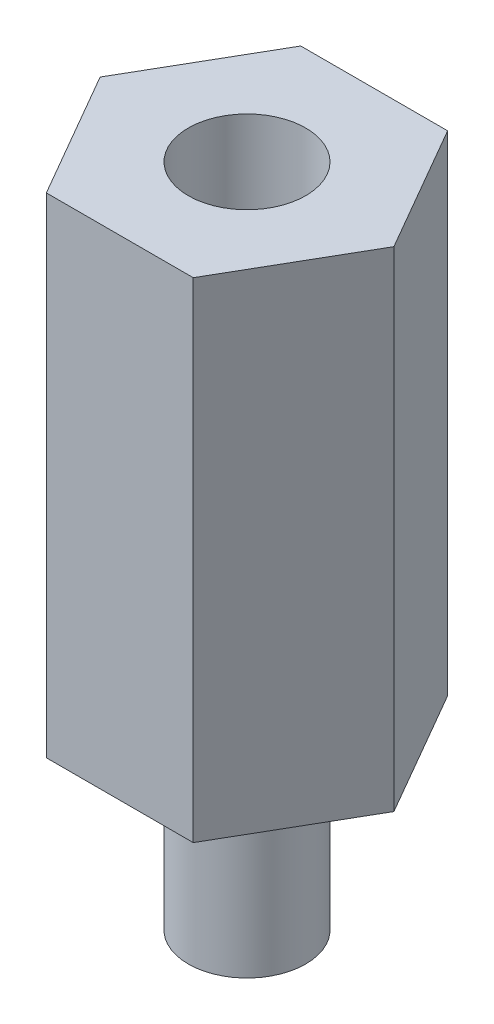
ISO-10303-21;
HEADER;
FILE_DESCRIPTION(('STEP AP214'),'2;1');
FILE_NAME('part.step','',(''),(''),'','','');
FILE_SCHEMA(('AUTOMOTIVE_DESIGN { 1 0 10303 214 1 1 1 1 }'));
ENDSEC;
DATA;
#1=APPLICATION_CONTEXT('core data for automotive mechanical design processes');
#2=APPLICATION_PROTOCOL_DEFINITION('international standard','automotive_design',2000,#1);
#3=PRODUCT_CONTEXT('',#1,'mechanical');
#4=PRODUCT('Part','Part','',(#3));
#5=PRODUCT_RELATED_PRODUCT_CATEGORY('part','',(#4));
#6=PRODUCT_DEFINITION_FORMATION('','',#4);
#7=PRODUCT_DEFINITION_CONTEXT('part definition',#1,'design');
#8=PRODUCT_DEFINITION('design','',#6,#7);
#9=PRODUCT_DEFINITION_SHAPE('','',#8);
#10=(LENGTH_UNIT() NAMED_UNIT(*) SI_UNIT(.MILLI.,.METRE.));
#11=(NAMED_UNIT(*) PLANE_ANGLE_UNIT() SI_UNIT($,.RADIAN.));
#12=(NAMED_UNIT(*) SI_UNIT($,.STERADIAN.) SOLID_ANGLE_UNIT());
#13=UNCERTAINTY_MEASURE_WITH_UNIT(LENGTH_MEASURE(1.E-05),#10,'distance_accuracy_value','');
#14=(GEOMETRIC_REPRESENTATION_CONTEXT(3) GLOBAL_UNCERTAINTY_ASSIGNED_CONTEXT((#13)) GLOBAL_UNIT_ASSIGNED_CONTEXT((#10,
#11,#12)) REPRESENTATION_CONTEXT('',''));
#15=CARTESIAN_POINT('',(0.,0.,0.));
#16=DIRECTION('',(0.,0.,1.));
#17=DIRECTION('',(1.,0.,0.));
#18=AXIS2_PLACEMENT_3D('',#15,#16,#17);
#19=CARTESIAN_POINT('',(0.,0.,0.));
#20=DIRECTION('',(0.,1.,0.));
#21=DIRECTION('',(0.,0.,1.));
#22=AXIS2_PLACEMENT_3D('',#19,#20,#21);
#23=PLANE('',#22);
#24=DIRECTION('',(0.500000000000001,0.,-0.866025403784438));
#25=VECTOR('',#24,1.);
#26=CARTESIAN_POINT('',(3.75277674973255,0.,6.50000000000001));
#27=LINE('',#26,#25);
#28=CARTESIAN_POINT('',(3.75277674973255,0.,6.50000000000001));
#29=VERTEX_POINT('',#28);
#30=CARTESIAN_POINT('',(7.50555349946513,0.,0.));
#31=VERTEX_POINT('',#30);
#32=EDGE_CURVE('E121',#29,#31,#27,.T.);
#33=ORIENTED_EDGE('',*,*,#32,.F.);
#34=DIRECTION('',(1.,0.,0.));
#35=VECTOR('',#34,1.);
#36=CARTESIAN_POINT('',(-3.75277674973258,0.,6.50000000000002));
#37=LINE('',#36,#35);
#38=CARTESIAN_POINT('',(-3.75277674973258,0.,6.50000000000002));
#39=VERTEX_POINT('',#38);
#40=EDGE_CURVE('E80',#39,#29,#37,.T.);
#41=ORIENTED_EDGE('',*,*,#40,.F.);
#42=DIRECTION('',(0.499999999999997,0.,0.866025403784441));
#43=VECTOR('',#42,1.);
#44=CARTESIAN_POINT('',(-7.50555349946513,0.,0.));
#45=LINE('',#44,#43);
#46=CARTESIAN_POINT('',(-7.50555349946513,0.,0.));
#47=VERTEX_POINT('',#46);
#48=EDGE_CURVE('E74',#47,#39,#45,.T.);
#49=ORIENTED_EDGE('',*,*,#48,.F.);
#50=DIRECTION('',(-0.499999999999999,0.,0.86602540378444));
#51=VECTOR('',#50,1.);
#52=CARTESIAN_POINT('',(-3.75277674973257,0.,-6.50000000000004));
#53=LINE('',#52,#51);
#54=CARTESIAN_POINT('',(-3.75277674973257,0.,-6.50000000000004));
#55=VERTEX_POINT('',#54);
#56=EDGE_CURVE('E111',#55,#47,#53,.T.);
#57=ORIENTED_EDGE('',*,*,#56,.F.);
#58=DIRECTION('',(-1.,0.,0.));
#59=VECTOR('',#58,1.);
#60=CARTESIAN_POINT('',(3.75277674973254,0.,-6.50000000000004));
#61=LINE('',#60,#59);
#62=CARTESIAN_POINT('',(3.75277674973254,0.,-6.50000000000004));
#63=VERTEX_POINT('',#62);
#64=EDGE_CURVE('E127',#63,#55,#61,.T.);
#65=ORIENTED_EDGE('',*,*,#64,.F.);
#66=DIRECTION('',(-0.5,0.,-0.866025403784438));
#67=VECTOR('',#66,1.);
#68=CARTESIAN_POINT('',(7.50555349946513,0.,0.));
#69=LINE('',#68,#67);
#70=EDGE_CURVE('E124',#31,#63,#69,.T.);
#71=ORIENTED_EDGE('',*,*,#70,.F.);
#72=EDGE_LOOP('',(#33,#41,#49,#57,#65,#71));
#73=FACE_BOUND('',#72,.T.);
#74=CARTESIAN_POINT('',(0.,0.,0.));
#75=DIRECTION('',(0.,1.,0.));
#76=DIRECTION('',(0.,0.,1.));
#77=AXIS2_PLACEMENT_3D('',#74,#75,#76);
#78=CIRCLE('',#77,3.);
#79=CARTESIAN_POINT('',(0.,0.,3.));
#80=VERTEX_POINT('',#79);
#81=EDGE_CURVE('E11',#80,#80,#78,.F.);
#82=ORIENTED_EDGE('',*,*,#81,.F.);
#83=EDGE_LOOP('',(#82));
#84=FACE_BOUND('',#83,.T.);
#85=ADVANCED_FACE('F33',(#73,#84),#23,.F.);
#86=CARTESIAN_POINT('',(3.75277674973255,25.,6.50000000000001));
#87=DIRECTION('',(-0.866025403784438,0.,-0.500000000000001));
#88=DIRECTION('',(-0.500000000000001,0.,0.866025403784438));
#89=AXIS2_PLACEMENT_3D('',#86,#87,#88);
#90=PLANE('',#89);
#91=ORIENTED_EDGE('',*,*,#32,.T.);
#92=DIRECTION('',(0.,-1.,0.));
#93=VECTOR('',#92,1.);
#94=CARTESIAN_POINT('',(7.50555349946513,25.,0.));
#95=LINE('',#94,#93);
#96=CARTESIAN_POINT('',(7.50555349946513,25.,0.));
#97=VERTEX_POINT('',#96);
#98=EDGE_CURVE('E42',#97,#31,#95,.T.);
#99=ORIENTED_EDGE('',*,*,#98,.F.);
#100=DIRECTION('',(0.500000000000001,0.,-0.866025403784438));
#101=VECTOR('',#100,1.);
#102=CARTESIAN_POINT('',(3.75277674973255,25.,6.50000000000001));
#103=LINE('',#102,#101);
#104=CARTESIAN_POINT('',(3.75277674973255,25.,6.50000000000001));
#105=VERTEX_POINT('',#104);
#106=EDGE_CURVE('E132',#105,#97,#103,.T.);
#107=ORIENTED_EDGE('',*,*,#106,.F.);
#108=DIRECTION('',(0.,-1.,0.));
#109=VECTOR('',#108,1.);
#110=CARTESIAN_POINT('',(3.75277674973255,25.,6.50000000000001));
#111=LINE('',#110,#109);
#112=EDGE_CURVE('E117',#105,#29,#111,.T.);
#113=ORIENTED_EDGE('',*,*,#112,.T.);
#114=EDGE_LOOP('',(#91,#99,#107,#113));
#115=FACE_BOUND('',#114,.T.);
#116=ADVANCED_FACE('F35',(#115),#90,.F.);
#117=CARTESIAN_POINT('',(7.50555349946513,25.,0.));
#118=DIRECTION('',(-0.866025403784438,0.,0.5));
#119=DIRECTION('',(0.5,0.,0.866025403784439));
#120=AXIS2_PLACEMENT_3D('',#117,#118,#119);
#121=PLANE('',#120);
#122=ORIENTED_EDGE('',*,*,#70,.T.);
#123=DIRECTION('',(0.,-1.,0.));
#124=VECTOR('',#123,1.);
#125=CARTESIAN_POINT('',(3.75277674973254,25.,-6.50000000000004));
#126=LINE('',#125,#124);
#127=CARTESIAN_POINT('',(3.75277674973254,25.,-6.50000000000004));
#128=VERTEX_POINT('',#127);
#129=EDGE_CURVE('E136',#128,#63,#126,.T.);
#130=ORIENTED_EDGE('',*,*,#129,.F.);
#131=DIRECTION('',(-0.5,0.,-0.866025403784438));
#132=VECTOR('',#131,1.);
#133=CARTESIAN_POINT('',(7.50555349946513,25.,0.));
#134=LINE('',#133,#132);
#135=EDGE_CURVE('E89',#97,#128,#134,.T.);
#136=ORIENTED_EDGE('',*,*,#135,.F.);
#137=ORIENTED_EDGE('',*,*,#98,.T.);
#138=EDGE_LOOP('',(#122,#130,#136,#137));
#139=FACE_BOUND('',#138,.T.);
#140=ADVANCED_FACE('F139',(#139),#121,.F.);
#141=CARTESIAN_POINT('',(3.75277674973254,25.,-6.50000000000004));
#142=DIRECTION('',(0.,0.,1.));
#143=DIRECTION('',(1.,0.,0.));
#144=AXIS2_PLACEMENT_3D('',#141,#142,#143);
#145=PLANE('',#144);
#146=ORIENTED_EDGE('',*,*,#64,.T.);
#147=DIRECTION('',(0.,-1.,0.));
#148=VECTOR('',#147,1.);
#149=CARTESIAN_POINT('',(-3.75277674973257,25.,-6.50000000000004));
#150=LINE('',#149,#148);
#151=CARTESIAN_POINT('',(-3.75277674973257,25.,-6.50000000000004));
#152=VERTEX_POINT('',#151);
#153=EDGE_CURVE('E112',#152,#55,#150,.T.);
#154=ORIENTED_EDGE('',*,*,#153,.F.);
#155=DIRECTION('',(-1.,0.,0.));
#156=VECTOR('',#155,1.);
#157=CARTESIAN_POINT('',(3.75277674973254,25.,-6.50000000000004));
#158=LINE('',#157,#156);
#159=EDGE_CURVE('E103',#128,#152,#158,.T.);
#160=ORIENTED_EDGE('',*,*,#159,.F.);
#161=ORIENTED_EDGE('',*,*,#129,.T.);
#162=EDGE_LOOP('',(#146,#154,#160,#161));
#163=FACE_BOUND('',#162,.T.);
#164=ADVANCED_FACE('F147',(#163),#145,.F.);
#165=CARTESIAN_POINT('',(-3.75277674973257,25.,-6.50000000000004));
#166=DIRECTION('',(0.866025403784439,0.,0.499999999999998));
#167=DIRECTION('',(0.499999999999998,0.,-0.86602540378444));
#168=AXIS2_PLACEMENT_3D('',#165,#166,#167);
#169=PLANE('',#168);
#170=ORIENTED_EDGE('',*,*,#56,.T.);
#171=DIRECTION('',(0.,-1.,0.));
#172=VECTOR('',#171,1.);
#173=CARTESIAN_POINT('',(-7.50555349946513,25.,0.));
#174=LINE('',#173,#172);
#175=CARTESIAN_POINT('',(-7.50555349946513,25.,0.));
#176=VERTEX_POINT('',#175);
#177=EDGE_CURVE('E108',#176,#47,#174,.T.);
#178=ORIENTED_EDGE('',*,*,#177,.F.);
#179=DIRECTION('',(-0.499999999999999,0.,0.86602540378444));
#180=VECTOR('',#179,1.);
#181=CARTESIAN_POINT('',(-3.75277674973257,25.,-6.50000000000004));
#182=LINE('',#181,#180);
#183=EDGE_CURVE('E97',#152,#176,#182,.T.);
#184=ORIENTED_EDGE('',*,*,#183,.F.);
#185=ORIENTED_EDGE('',*,*,#153,.T.);
#186=EDGE_LOOP('',(#170,#178,#184,#185));
#187=FACE_BOUND('',#186,.T.);
#188=ADVANCED_FACE('F109',(#187),#169,.F.);
#189=CARTESIAN_POINT('',(-7.50555349946513,25.,0.));
#190=DIRECTION('',(0.866025403784441,0.,-0.499999999999997));
#191=DIRECTION('',(-0.499999999999997,0.,-0.866025403784441));
#192=AXIS2_PLACEMENT_3D('',#189,#190,#191);
#193=PLANE('',#192);
#194=ORIENTED_EDGE('',*,*,#48,.T.);
#195=DIRECTION('',(0.,-1.,0.));
#196=VECTOR('',#195,1.);
#197=CARTESIAN_POINT('',(-3.75277674973258,25.,6.50000000000002));
#198=LINE('',#197,#196);
#199=CARTESIAN_POINT('',(-3.75277674973258,25.,6.50000000000002));
#200=VERTEX_POINT('',#199);
#201=EDGE_CURVE('E113',#200,#39,#198,.T.);
#202=ORIENTED_EDGE('',*,*,#201,.F.);
#203=DIRECTION('',(0.499999999999997,0.,0.866025403784441));
#204=VECTOR('',#203,1.);
#205=CARTESIAN_POINT('',(-7.50555349946513,25.,0.));
#206=LINE('',#205,#204);
#207=EDGE_CURVE('E101',#176,#200,#206,.T.);
#208=ORIENTED_EDGE('',*,*,#207,.F.);
#209=ORIENTED_EDGE('',*,*,#177,.T.);
#210=EDGE_LOOP('',(#194,#202,#208,#209));
#211=FACE_BOUND('',#210,.T.);
#212=ADVANCED_FACE('F115',(#211),#193,.F.);
#213=CARTESIAN_POINT('',(-3.75277674973258,25.,6.50000000000002));
#214=DIRECTION('',(0.,0.,-1.));
#215=DIRECTION('',(-1.,0.,0.));
#216=AXIS2_PLACEMENT_3D('',#213,#214,#215);
#217=PLANE('',#216);
#218=ORIENTED_EDGE('',*,*,#40,.T.);
#219=ORIENTED_EDGE('',*,*,#112,.F.);
#220=DIRECTION('',(1.,0.,0.));
#221=VECTOR('',#220,1.);
#222=CARTESIAN_POINT('',(-3.75277674973258,25.,6.50000000000002));
#223=LINE('',#222,#221);
#224=EDGE_CURVE('E50',#200,#105,#223,.T.);
#225=ORIENTED_EDGE('',*,*,#224,.F.);
#226=ORIENTED_EDGE('',*,*,#201,.T.);
#227=EDGE_LOOP('',(#218,#219,#225,#226));
#228=FACE_BOUND('',#227,.T.);
#229=ADVANCED_FACE('F164',(#228),#217,.F.);
#230=CARTESIAN_POINT('',(0.,25.,0.));
#231=DIRECTION('',(0.,1.,0.));
#232=DIRECTION('',(0.,0.,1.));
#233=AXIS2_PLACEMENT_3D('',#230,#231,#232);
#234=PLANE('',#233);
#235=CARTESIAN_POINT('',(0.,25.,0.));
#236=DIRECTION('',(0.,1.,0.));
#237=DIRECTION('',(0.,0.,1.));
#238=AXIS2_PLACEMENT_3D('',#235,#236,#237);
#239=CIRCLE('',#238,3.);
#240=CARTESIAN_POINT('',(0.,25.,3.));
#241=VERTEX_POINT('',#240);
#242=EDGE_CURVE('E156',#241,#241,#239,.T.);
#243=ORIENTED_EDGE('',*,*,#242,.F.);
#244=EDGE_LOOP('',(#243));
#245=FACE_BOUND('',#244,.T.);
#246=ORIENTED_EDGE('',*,*,#106,.T.);
#247=ORIENTED_EDGE('',*,*,#135,.T.);
#248=ORIENTED_EDGE('',*,*,#159,.T.);
#249=ORIENTED_EDGE('',*,*,#183,.T.);
#250=ORIENTED_EDGE('',*,*,#207,.T.);
#251=ORIENTED_EDGE('',*,*,#224,.T.);
#252=EDGE_LOOP('',(#246,#247,#248,#249,#250,#251));
#253=FACE_BOUND('',#252,.T.);
#254=ADVANCED_FACE('F99',(#245,#253),#234,.T.);
#255=CARTESIAN_POINT('',(0.,-9.,0.));
#256=DIRECTION('',(0.,1.,0.));
#257=DIRECTION('',(0.,0.,1.));
#258=AXIS2_PLACEMENT_3D('',#255,#256,#257);
#259=CYLINDRICAL_SURFACE('',#258,3.);
#260=CARTESIAN_POINT('',(0.,-9.,0.));
#261=DIRECTION('',(0.,-1.,0.));
#262=DIRECTION('',(0.,0.,-1.));
#263=AXIS2_PLACEMENT_3D('',#260,#261,#262);
#264=CIRCLE('',#263,3.);
#265=CARTESIAN_POINT('',(0.,-9.,-3.));
#266=VERTEX_POINT('',#265);
#267=EDGE_CURVE('E125',#266,#266,#264,.T.);
#268=ORIENTED_EDGE('',*,*,#267,.F.);
#269=EDGE_LOOP('',(#268));
#270=FACE_BOUND('',#269,.T.);
#271=ORIENTED_EDGE('',*,*,#81,.T.);
#272=EDGE_LOOP('',(#271));
#273=FACE_BOUND('',#272,.T.);
#274=ADVANCED_FACE('F163',(#270,#273),#259,.T.);
#275=CARTESIAN_POINT('',(0.,-9.,0.));
#276=DIRECTION('',(0.,-1.,0.));
#277=DIRECTION('',(0.,0.,-1.));
#278=AXIS2_PLACEMENT_3D('',#275,#276,#277);
#279=PLANE('',#278);
#280=ORIENTED_EDGE('',*,*,#267,.T.);
#281=EDGE_LOOP('',(#280));
#282=FACE_BOUND('',#281,.T.);
#283=ADVANCED_FACE('F170',(#282),#279,.T.);
#284=CARTESIAN_POINT('',(0.,16.,0.));
#285=DIRECTION('',(0.,1.,0.));
#286=DIRECTION('',(0.,0.,1.));
#287=AXIS2_PLACEMENT_3D('',#284,#285,#286);
#288=CONICAL_SURFACE('',#287,3.,1.02974425867665);
#289=CARTESIAN_POINT('',(0.,14.1974181429173,0.));
#290=VERTEX_POINT('',#289);
#291=VERTEX_LOOP('',#290);
#292=FACE_BOUND('',#291,.T.);
#293=CARTESIAN_POINT('',(0.,16.,0.));
#294=DIRECTION('',(0.,1.,0.));
#295=DIRECTION('',(0.,0.,1.));
#296=AXIS2_PLACEMENT_3D('',#293,#294,#295);
#297=CIRCLE('',#296,3.);
#298=CARTESIAN_POINT('',(0.,16.,3.));
#299=VERTEX_POINT('',#298);
#300=EDGE_CURVE('E153',#299,#299,#297,.T.);
#301=ORIENTED_EDGE('',*,*,#300,.T.);
#302=EDGE_LOOP('',(#301));
#303=FACE_BOUND('',#302,.T.);
#304=ADVANCED_FACE('F225',(#292,#303),#288,.F.);
#305=CARTESIAN_POINT('',(0.,25.,0.));
#306=DIRECTION('',(0.,1.,0.));
#307=DIRECTION('',(0.,0.,1.));
#308=AXIS2_PLACEMENT_3D('',#305,#306,#307);
#309=CYLINDRICAL_SURFACE('',#308,3.);
#310=ORIENTED_EDGE('',*,*,#300,.F.);
#311=EDGE_LOOP('',(#310));
#312=FACE_BOUND('',#311,.T.);
#313=ORIENTED_EDGE('',*,*,#242,.T.);
#314=EDGE_LOOP('',(#313));
#315=FACE_BOUND('',#314,.T.);
#316=ADVANCED_FACE('F160',(#312,#315),#309,.F.);
#317=CLOSED_SHELL('',(#85,#116,#140,#164,#188,#212,#229,#254,#274,#283,#304,#316));
#318=MANIFOLD_SOLID_BREP('B2',#317);
#319=ADVANCED_BREP_SHAPE_REPRESENTATION('',(#18,#318),#14);
#320=SHAPE_DEFINITION_REPRESENTATION(#9,#319);
ENDSEC;
END-ISO-10303-21;
